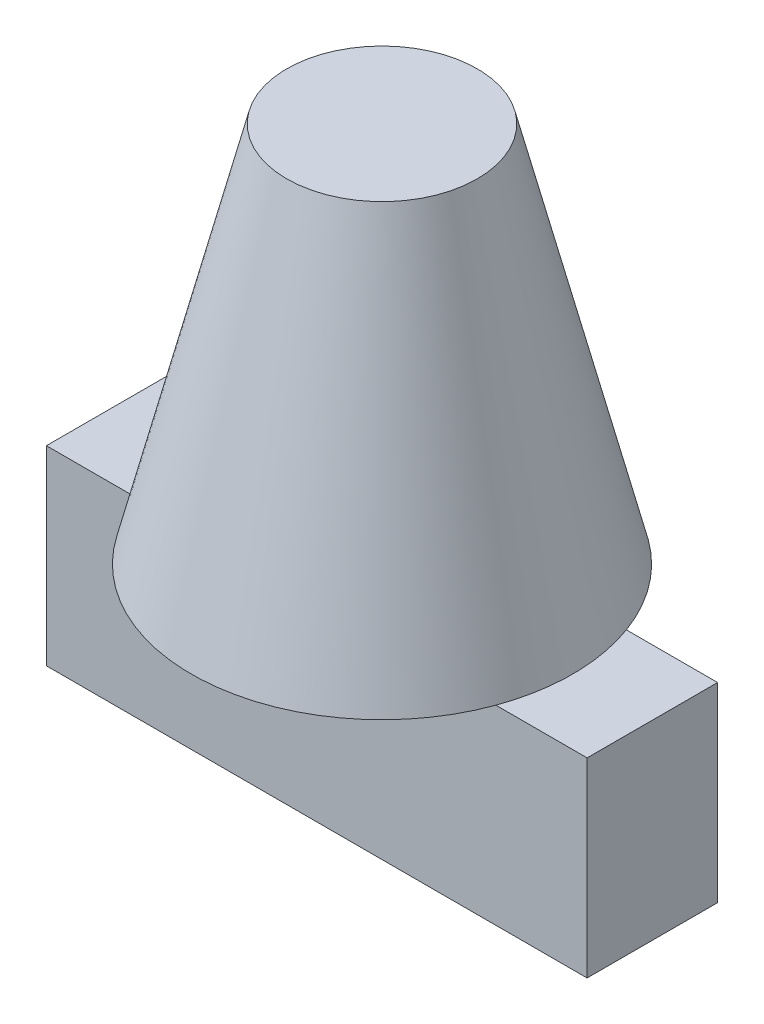
ISO-10303-21;
HEADER;
FILE_DESCRIPTION(('STEP AP214'),'2;1');
FILE_NAME('part.step','',(''),(''),'','','');
FILE_SCHEMA(('AUTOMOTIVE_DESIGN { 1 0 10303 214 1 1 1 1 }'));
ENDSEC;
DATA;
#1=APPLICATION_CONTEXT('core data for automotive mechanical design processes');
#2=APPLICATION_PROTOCOL_DEFINITION('international standard','automotive_design',2000,#1);
#3=PRODUCT_CONTEXT('',#1,'mechanical');
#4=PRODUCT('Part','Part','',(#3));
#5=PRODUCT_RELATED_PRODUCT_CATEGORY('part','',(#4));
#6=PRODUCT_DEFINITION_FORMATION('','',#4);
#7=PRODUCT_DEFINITION_CONTEXT('part definition',#1,'design');
#8=PRODUCT_DEFINITION('design','',#6,#7);
#9=PRODUCT_DEFINITION_SHAPE('','',#8);
#10=(LENGTH_UNIT() NAMED_UNIT(*) SI_UNIT(.MILLI.,.METRE.));
#11=(NAMED_UNIT(*) PLANE_ANGLE_UNIT() SI_UNIT($,.RADIAN.));
#12=(NAMED_UNIT(*) SI_UNIT($,.STERADIAN.) SOLID_ANGLE_UNIT());
#13=UNCERTAINTY_MEASURE_WITH_UNIT(LENGTH_MEASURE(1.E-05),#10,'distance_accuracy_value','');
#14=(GEOMETRIC_REPRESENTATION_CONTEXT(3) GLOBAL_UNCERTAINTY_ASSIGNED_CONTEXT((#13)) GLOBAL_UNIT_ASSIGNED_CONTEXT((#10,
#11,#12)) REPRESENTATION_CONTEXT('',''));
#15=CARTESIAN_POINT('',(0.,0.,0.));
#16=DIRECTION('',(0.,0.,1.));
#17=DIRECTION('',(1.,0.,0.));
#18=AXIS2_PLACEMENT_3D('',#15,#16,#17);
#19=CARTESIAN_POINT('',(0.,0.,0.));
#20=DIRECTION('',(0.,1.,0.));
#21=DIRECTION('',(0.,0.,1.));
#22=AXIS2_PLACEMENT_3D('',#19,#20,#21);
#23=PLANE('',#22);
#24=DIRECTION('',(1.,0.,0.));
#25=VECTOR('',#24,1.);
#26=CARTESIAN_POINT('',(-14.1808799225455,0.,-3.42247305666327));
#27=LINE('',#26,#25);
#28=CARTESIAN_POINT('',(-9.39609869669437,0.,-3.42247317092474));
#29=VERTEX_POINT('',#28);
#30=CARTESIAN_POINT('',(9.39609755531895,0.,-3.42247349947656));
#31=VERTEX_POINT('',#30);
#32=EDGE_CURVE('E12',#29,#31,#27,.T.);
#33=ORIENTED_EDGE('',*,*,#32,.F.);
#34=CARTESIAN_POINT('',(0.,0.,0.));
#35=DIRECTION('',(0.,1.,0.));
#36=DIRECTION('',(0.,0.,1.));
#37=AXIS2_PLACEMENT_3D('',#34,#35,#36);
#38=CIRCLE('',#37,10.);
#39=EDGE_CURVE('E53',#31,#29,#38,.T.);
#40=ORIENTED_EDGE('',*,*,#39,.F.);
#41=EDGE_LOOP('',(#33,#40));
#42=FACE_BOUND('',#41,.T.);
#43=ADVANCED_FACE('F35',(#42),#23,.F.);
#44=DIRECTION('',(-1.,0.,0.));
#45=VECTOR('',#44,1.);
#46=CARTESIAN_POINT('',(-14.1808799225455,0.,3.42247305666327));
#47=LINE('',#46,#45);
#48=CARTESIAN_POINT('',(9.39609869669437,0.,3.42247317092476));
#49=VERTEX_POINT('',#48);
#50=CARTESIAN_POINT('',(-9.39609633964016,0.,3.42247305666327));
#51=VERTEX_POINT('',#50);
#52=EDGE_CURVE('E45',#49,#51,#47,.T.);
#53=ORIENTED_EDGE('',*,*,#52,.F.);
#54=EDGE_CURVE('E39',#51,#49,#38,.T.);
#55=ORIENTED_EDGE('',*,*,#54,.F.);
#56=EDGE_LOOP('',(#53,#55));
#57=FACE_BOUND('',#56,.T.);
#58=ADVANCED_FACE('F197',(#57),#23,.F.);
#59=CARTESIAN_POINT('',(0.,20.,0.));
#60=DIRECTION('',(0.,1.,0.));
#61=DIRECTION('',(0.,0.,1.));
#62=AXIS2_PLACEMENT_3D('',#59,#60,#61);
#63=PLANE('',#62);
#64=CARTESIAN_POINT('',(0.,20.,0.));
#65=DIRECTION('',(0.,1.,0.));
#66=DIRECTION('',(0.,0.,1.));
#67=AXIS2_PLACEMENT_3D('',#64,#65,#66);
#68=CIRCLE('',#67,5.);
#69=CARTESIAN_POINT('',(0.,20.,5.));
#70=VERTEX_POINT('',#69);
#71=EDGE_CURVE('E114',#70,#70,#68,.T.);
#72=ORIENTED_EDGE('',*,*,#71,.T.);
#73=EDGE_LOOP('',(#72));
#74=FACE_BOUND('',#73,.T.);
#75=ADVANCED_FACE('F191',(#74),#63,.T.);
#76=CARTESIAN_POINT('',(0.,20.,0.));
#77=DIRECTION('',(0.,-1.,0.));
#78=DIRECTION('',(0.,0.,-1.));
#79=AXIS2_PLACEMENT_3D('',#76,#77,#78);
#80=CONICAL_SURFACE('',#79,5.,0.244978663126864);
#81=ORIENTED_EDGE('',*,*,#71,.F.);
#82=EDGE_LOOP('',(#81));
#83=FACE_BOUND('',#82,.T.);
#84=EDGE_CURVE('E138',#49,#31,#38,.T.);
#85=ORIENTED_EDGE('',*,*,#84,.T.);
#86=ORIENTED_EDGE('',*,*,#39,.T.);
#87=EDGE_CURVE('E150',#29,#51,#38,.T.);
#88=ORIENTED_EDGE('',*,*,#87,.T.);
#89=ORIENTED_EDGE('',*,*,#54,.T.);
#90=EDGE_LOOP('',(#85,#86,#88,#89));
#91=FACE_BOUND('',#90,.T.);
#92=ADVANCED_FACE('F157',(#83,#91),#80,.T.);
#93=CARTESIAN_POINT('',(0.,0.,0.));
#94=DIRECTION('',(0.,1.,0.));
#95=DIRECTION('',(0.,0.,1.));
#96=AXIS2_PLACEMENT_3D('',#93,#94,#95);
#97=PLANE('',#96);
#98=CARTESIAN_POINT('',(-14.1808799225455,0.,3.42247305666327));
#99=VERTEX_POINT('',#98);
#100=EDGE_CURVE('E165',#51,#99,#47,.T.);
#101=ORIENTED_EDGE('',*,*,#100,.F.);
#102=ORIENTED_EDGE('',*,*,#87,.F.);
#103=CARTESIAN_POINT('',(-14.1808799225455,0.,-3.42247305666327));
#104=VERTEX_POINT('',#103);
#105=EDGE_CURVE('E109',#104,#29,#27,.T.);
#106=ORIENTED_EDGE('',*,*,#105,.F.);
#107=DIRECTION('',(0.,0.,-1.));
#108=VECTOR('',#107,1.);
#109=CARTESIAN_POINT('',(-14.1808799225455,0.,-3.42247305666327));
#110=LINE('',#109,#108);
#111=EDGE_CURVE('E130',#99,#104,#110,.T.);
#112=ORIENTED_EDGE('',*,*,#111,.F.);
#113=EDGE_LOOP('',(#101,#102,#106,#112));
#114=FACE_BOUND('',#113,.T.);
#115=ADVANCED_FACE('F183',(#114),#97,.T.);
#116=CARTESIAN_POINT('',(14.1808799225455,-10.,-3.42247305666327));
#117=DIRECTION('',(-1.,0.,0.));
#118=DIRECTION('',(0.,0.,1.));
#119=AXIS2_PLACEMENT_3D('',#116,#117,#118);
#120=PLANE('',#119);
#121=DIRECTION('',(0.,0.,1.));
#122=VECTOR('',#121,1.);
#123=CARTESIAN_POINT('',(14.1808799225455,0.,-3.42247305666327));
#124=LINE('',#123,#122);
#125=CARTESIAN_POINT('',(14.1808799225455,0.,-3.42247305666327));
#126=VERTEX_POINT('',#125);
#127=CARTESIAN_POINT('',(14.1808799225455,0.,3.42247305666327));
#128=VERTEX_POINT('',#127);
#129=EDGE_CURVE('E113',#126,#128,#124,.T.);
#130=ORIENTED_EDGE('',*,*,#129,.T.);
#131=DIRECTION('',(0.,1.,0.));
#132=VECTOR('',#131,1.);
#133=CARTESIAN_POINT('',(14.1808799225455,-10.,3.42247305666327));
#134=LINE('',#133,#132);
#135=CARTESIAN_POINT('',(14.1808799225455,-10.,3.42247305666327));
#136=VERTEX_POINT('',#135);
#137=EDGE_CURVE('E93',#136,#128,#134,.T.);
#138=ORIENTED_EDGE('',*,*,#137,.F.);
#139=DIRECTION('',(0.,0.,1.));
#140=VECTOR('',#139,1.);
#141=CARTESIAN_POINT('',(14.1808799225455,-10.,-3.42247305666327));
#142=LINE('',#141,#140);
#143=CARTESIAN_POINT('',(14.1808799225455,-10.,-3.42247305666327));
#144=VERTEX_POINT('',#143);
#145=EDGE_CURVE('E100',#144,#136,#142,.T.);
#146=ORIENTED_EDGE('',*,*,#145,.F.);
#147=DIRECTION('',(0.,1.,0.));
#148=VECTOR('',#147,1.);
#149=CARTESIAN_POINT('',(14.1808799225455,-10.,-3.42247305666327));
#150=LINE('',#149,#148);
#151=EDGE_CURVE('E132',#144,#126,#150,.T.);
#152=ORIENTED_EDGE('',*,*,#151,.T.);
#153=EDGE_LOOP('',(#130,#138,#146,#152));
#154=FACE_BOUND('',#153,.T.);
#155=ADVANCED_FACE('F111',(#154),#120,.F.);
#156=CARTESIAN_POINT('',(-14.1808799225455,-10.,3.42247305666327));
#157=DIRECTION('',(0.,0.,-1.));
#158=DIRECTION('',(-1.,0.,0.));
#159=AXIS2_PLACEMENT_3D('',#156,#157,#158);
#160=PLANE('',#159);
#161=EDGE_CURVE('E163',#128,#49,#47,.T.);
#162=ORIENTED_EDGE('',*,*,#161,.T.);
#163=ORIENTED_EDGE('',*,*,#52,.T.);
#164=ORIENTED_EDGE('',*,*,#100,.T.);
#165=DIRECTION('',(0.,1.,0.));
#166=VECTOR('',#165,1.);
#167=CARTESIAN_POINT('',(-14.1808799225455,-10.,3.42247305666327));
#168=LINE('',#167,#166);
#169=CARTESIAN_POINT('',(-14.1808799225455,-10.,3.42247305666327));
#170=VERTEX_POINT('',#169);
#171=EDGE_CURVE('E96',#170,#99,#168,.T.);
#172=ORIENTED_EDGE('',*,*,#171,.F.);
#173=DIRECTION('',(-1.,0.,0.));
#174=VECTOR('',#173,1.);
#175=CARTESIAN_POINT('',(-14.1808799225455,-10.,3.42247305666327));
#176=LINE('',#175,#174);
#177=EDGE_CURVE('E88',#136,#170,#176,.T.);
#178=ORIENTED_EDGE('',*,*,#177,.F.);
#179=ORIENTED_EDGE('',*,*,#137,.T.);
#180=EDGE_LOOP('',(#162,#163,#164,#172,#178,#179));
#181=FACE_BOUND('',#180,.T.);
#182=ADVANCED_FACE('F91',(#181),#160,.F.);
#183=CARTESIAN_POINT('',(-14.1808799225455,-10.,-3.42247305666327));
#184=DIRECTION('',(1.,0.,0.));
#185=DIRECTION('',(0.,0.,-1.));
#186=AXIS2_PLACEMENT_3D('',#183,#184,#185);
#187=PLANE('',#186);
#188=ORIENTED_EDGE('',*,*,#111,.T.);
#189=DIRECTION('',(0.,1.,0.));
#190=VECTOR('',#189,1.);
#191=CARTESIAN_POINT('',(-14.1808799225455,-10.,-3.42247305666327));
#192=LINE('',#191,#190);
#193=CARTESIAN_POINT('',(-14.1808799225455,-10.,-3.42247305666327));
#194=VERTEX_POINT('',#193);
#195=EDGE_CURVE('E118',#194,#104,#192,.T.);
#196=ORIENTED_EDGE('',*,*,#195,.F.);
#197=DIRECTION('',(0.,0.,-1.));
#198=VECTOR('',#197,1.);
#199=CARTESIAN_POINT('',(-14.1808799225455,-10.,-3.42247305666327));
#200=LINE('',#199,#198);
#201=EDGE_CURVE('E99',#170,#194,#200,.T.);
#202=ORIENTED_EDGE('',*,*,#201,.F.);
#203=ORIENTED_EDGE('',*,*,#171,.T.);
#204=EDGE_LOOP('',(#188,#196,#202,#203));
#205=FACE_BOUND('',#204,.T.);
#206=ADVANCED_FACE('F177',(#205),#187,.F.);
#207=CARTESIAN_POINT('',(-14.1808799225455,-10.,-3.42247305666327));
#208=DIRECTION('',(0.,0.,1.));
#209=DIRECTION('',(1.,0.,0.));
#210=AXIS2_PLACEMENT_3D('',#207,#208,#209);
#211=PLANE('',#210);
#212=ORIENTED_EDGE('',*,*,#105,.T.);
#213=ORIENTED_EDGE('',*,*,#32,.T.);
#214=EDGE_CURVE('E125',#31,#126,#27,.T.);
#215=ORIENTED_EDGE('',*,*,#214,.T.);
#216=ORIENTED_EDGE('',*,*,#151,.F.);
#217=DIRECTION('',(1.,0.,0.));
#218=VECTOR('',#217,1.);
#219=CARTESIAN_POINT('',(-14.1808799225455,-10.,-3.42247305666327));
#220=LINE('',#219,#218);
#221=EDGE_CURVE('E105',#194,#144,#220,.T.);
#222=ORIENTED_EDGE('',*,*,#221,.F.);
#223=ORIENTED_EDGE('',*,*,#195,.T.);
#224=EDGE_LOOP('',(#212,#213,#215,#216,#222,#223));
#225=FACE_BOUND('',#224,.T.);
#226=ADVANCED_FACE('F181',(#225),#211,.F.);
#227=CARTESIAN_POINT('',(0.,-10.,0.));
#228=DIRECTION('',(0.,1.,0.));
#229=DIRECTION('',(0.,0.,1.));
#230=AXIS2_PLACEMENT_3D('',#227,#228,#229);
#231=PLANE('',#230);
#232=ORIENTED_EDGE('',*,*,#145,.T.);
#233=ORIENTED_EDGE('',*,*,#177,.T.);
#234=ORIENTED_EDGE('',*,*,#201,.T.);
#235=ORIENTED_EDGE('',*,*,#221,.T.);
#236=EDGE_LOOP('',(#232,#233,#234,#235));
#237=FACE_BOUND('',#236,.T.);
#238=ADVANCED_FACE('F103',(#237),#231,.F.);
#239=ORIENTED_EDGE('',*,*,#214,.F.);
#240=ORIENTED_EDGE('',*,*,#84,.F.);
#241=ORIENTED_EDGE('',*,*,#161,.F.);
#242=ORIENTED_EDGE('',*,*,#129,.F.);
#243=EDGE_LOOP('',(#239,#240,#241,#242));
#244=FACE_BOUND('',#243,.T.);
#245=ADVANCED_FACE('F162',(#244),#97,.T.);
#246=CLOSED_SHELL('',(#43,#58,#75,#92,#115,#155,#182,#206,#226,#238,#245));
#247=MANIFOLD_SOLID_BREP('B2',#246);
#248=ADVANCED_BREP_SHAPE_REPRESENTATION('',(#18,#247),#14);
#249=SHAPE_DEFINITION_REPRESENTATION(#9,#248);
ENDSEC;
END-ISO-10303-21;
